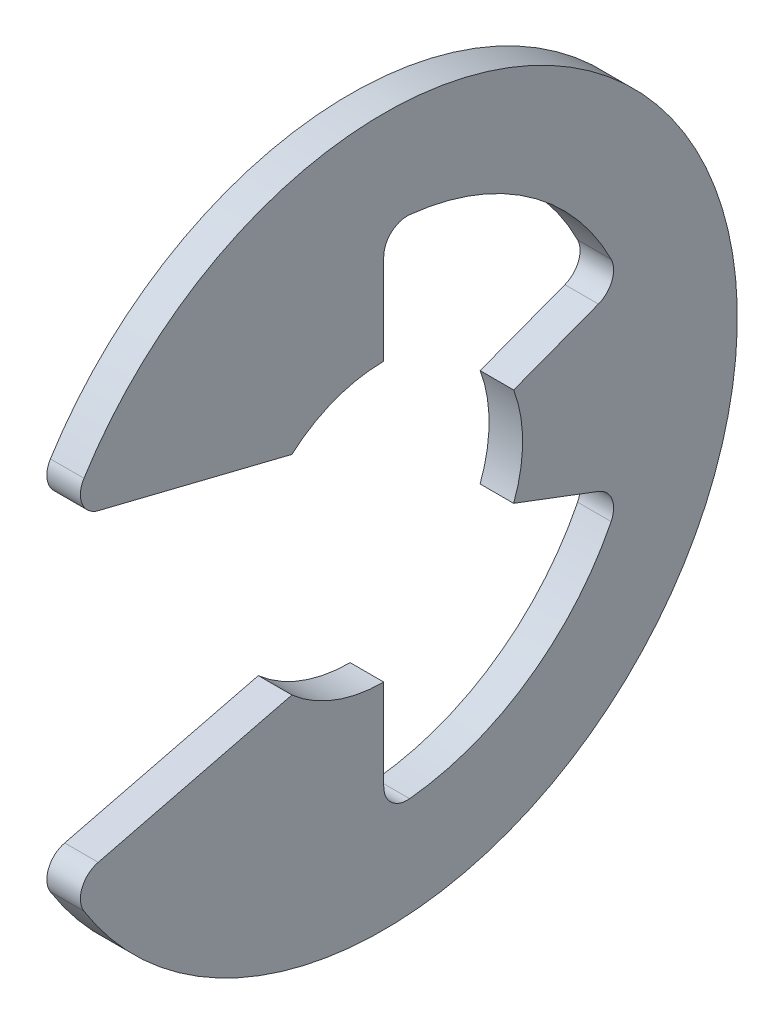
ISO-10303-21;
HEADER;
FILE_DESCRIPTION(('STEP AP214'),'2;1');
FILE_NAME('part.step','',(''),(''),'','','');
FILE_SCHEMA(('AUTOMOTIVE_DESIGN { 1 0 10303 214 1 1 1 1 }'));
ENDSEC;
DATA;
#1=APPLICATION_CONTEXT('core data for automotive mechanical design processes');
#2=APPLICATION_PROTOCOL_DEFINITION('international standard','automotive_design',2000,#1);
#3=PRODUCT_CONTEXT('',#1,'mechanical');
#4=PRODUCT('Part','Part','',(#3));
#5=PRODUCT_RELATED_PRODUCT_CATEGORY('part','',(#4));
#6=PRODUCT_DEFINITION_FORMATION('','',#4);
#7=PRODUCT_DEFINITION_CONTEXT('part definition',#1,'design');
#8=PRODUCT_DEFINITION('design','',#6,#7);
#9=PRODUCT_DEFINITION_SHAPE('','',#8);
#10=(LENGTH_UNIT() NAMED_UNIT(*) SI_UNIT(.MILLI.,.METRE.));
#11=(NAMED_UNIT(*) PLANE_ANGLE_UNIT() SI_UNIT($,.RADIAN.));
#12=(NAMED_UNIT(*) SI_UNIT($,.STERADIAN.) SOLID_ANGLE_UNIT());
#13=UNCERTAINTY_MEASURE_WITH_UNIT(LENGTH_MEASURE(1.E-05),#10,'distance_accuracy_value','');
#14=(GEOMETRIC_REPRESENTATION_CONTEXT(3) GLOBAL_UNCERTAINTY_ASSIGNED_CONTEXT((#13)) GLOBAL_UNIT_ASSIGNED_CONTEXT((#10,
#11,#12)) REPRESENTATION_CONTEXT('',''));
#15=CARTESIAN_POINT('',(0.,0.,0.));
#16=DIRECTION('',(0.,0.,1.));
#17=DIRECTION('',(1.,0.,0.));
#18=AXIS2_PLACEMENT_3D('',#15,#16,#17);
#19=CARTESIAN_POINT('',(0.3175,0.,0.));
#20=DIRECTION('',(-1.,0.,0.));
#21=DIRECTION('',(0.,0.,1.));
#22=AXIS2_PLACEMENT_3D('',#19,#20,#21);
#23=CYLINDRICAL_SURFACE('',#22,6.6929);
#24=CARTESIAN_POINT('',(0.3175,0.,0.));
#25=DIRECTION('',(1.,0.,0.));
#26=DIRECTION('',(0.,0.,-1.));
#27=AXIS2_PLACEMENT_3D('',#24,#25,#26);
#28=CIRCLE('',#27,6.6929);
#29=CARTESIAN_POINT('',(0.3175,-3.54889999540933,5.67452370094475));
#30=VERTEX_POINT('',#29);
#31=CARTESIAN_POINT('',(0.3175,3.54889999540933,5.67452370094475));
#32=VERTEX_POINT('',#31);
#33=EDGE_CURVE('E170',#30,#32,#28,.T.);
#34=ORIENTED_EDGE('',*,*,#33,.F.);
#35=DIRECTION('',(-1.,0.,0.));
#36=VECTOR('',#35,1.);
#37=CARTESIAN_POINT('',(0.3175,-3.54889999540933,5.67452370094475));
#38=LINE('',#37,#36);
#39=CARTESIAN_POINT('',(-0.3175,-3.54889999540933,5.67452370094475));
#40=VERTEX_POINT('',#39);
#41=EDGE_CURVE('E264',#30,#40,#38,.T.);
#42=ORIENTED_EDGE('',*,*,#41,.T.);
#43=CARTESIAN_POINT('',(-0.3175,0.,0.));
#44=DIRECTION('',(1.,0.,0.));
#45=DIRECTION('',(0.,0.,-1.));
#46=AXIS2_PLACEMENT_3D('',#43,#44,#45);
#47=CIRCLE('',#46,6.6929);
#48=CARTESIAN_POINT('',(-0.3175,3.54889999540933,5.67452370094475));
#49=VERTEX_POINT('',#48);
#50=EDGE_CURVE('E208',#40,#49,#47,.T.);
#51=ORIENTED_EDGE('',*,*,#50,.T.);
#52=DIRECTION('',(-1.,0.,0.));
#53=VECTOR('',#52,1.);
#54=CARTESIAN_POINT('',(0.3175,3.54889999540933,5.67452370094475));
#55=LINE('',#54,#53);
#56=EDGE_CURVE('E262',#49,#32,#55,.F.);
#57=ORIENTED_EDGE('',*,*,#56,.T.);
#58=EDGE_LOOP('',(#34,#42,#51,#57));
#59=FACE_BOUND('',#58,.T.);
#60=ADVANCED_FACE('F32',(#59),#23,.T.);
#61=CARTESIAN_POINT('',(0.3175,3.02251427254246,5.97154233697436));
#62=DIRECTION('',(0.,0.970536829925373,-0.240952820606872));
#63=DIRECTION('',(0.,0.240952820606873,0.970536829925373));
#64=AXIS2_PLACEMENT_3D('',#61,#62,#63);
#65=PLANE('',#64);
#66=DIRECTION('',(0.,-0.240952820606872,-0.970536829925373));
#67=VECTOR('',#66,1.);
#68=CARTESIAN_POINT('',(0.3175,3.02251427254246,5.97154233697436));
#69=LINE('',#68,#67);
#70=CARTESIAN_POINT('',(0.3175,2.88180092889208,5.40476132926225));
#71=VERTEX_POINT('',#70);
#72=CARTESIAN_POINT('',(0.3175,1.971675,1.73885390541443));
#73=VERTEX_POINT('',#72);
#74=EDGE_CURVE('E156',#71,#73,#69,.T.);
#75=ORIENTED_EDGE('',*,*,#74,.F.);
#76=DIRECTION('',(-1.,0.,0.));
#77=VECTOR('',#76,1.);
#78=CARTESIAN_POINT('',(0.3175,2.88180092889208,5.40476132926225));
#79=LINE('',#78,#77);
#80=CARTESIAN_POINT('',(-0.3175,2.88180092889208,5.40476132926225));
#81=VERTEX_POINT('',#80);
#82=EDGE_CURVE('E276',#71,#81,#79,.T.);
#83=ORIENTED_EDGE('',*,*,#82,.T.);
#84=DIRECTION('',(0.,-0.240952820606872,-0.970536829925373));
#85=VECTOR('',#84,1.);
#86=CARTESIAN_POINT('',(-0.3175,3.02251427254246,5.97154233697436));
#87=LINE('',#86,#85);
#88=CARTESIAN_POINT('',(-0.3175,1.971675,1.73885390541443));
#89=VERTEX_POINT('',#88);
#90=EDGE_CURVE('E176',#81,#89,#87,.T.);
#91=ORIENTED_EDGE('',*,*,#90,.T.);
#92=DIRECTION('',(-1.,0.,0.));
#93=VECTOR('',#92,1.);
#94=CARTESIAN_POINT('',(0.3175,1.971675,1.73885390541443));
#95=LINE('',#94,#93);
#96=EDGE_CURVE('E173',#73,#89,#95,.T.);
#97=ORIENTED_EDGE('',*,*,#96,.F.);
#98=EDGE_LOOP('',(#75,#83,#91,#97));
#99=FACE_BOUND('',#98,.T.);
#100=ADVANCED_FACE('F174',(#99),#65,.F.);
#101=CARTESIAN_POINT('',(0.3175,0.,0.));
#102=DIRECTION('',(-1.,0.,0.));
#103=DIRECTION('',(0.,0.,1.));
#104=AXIS2_PLACEMENT_3D('',#101,#102,#103);
#105=CYLINDRICAL_SURFACE('',#104,2.6289);
#106=CARTESIAN_POINT('',(-0.3175,0.,0.));
#107=DIRECTION('',(-1.,0.,0.));
#108=DIRECTION('',(0.,0.,1.));
#109=AXIS2_PLACEMENT_3D('',#106,#107,#108);
#110=CIRCLE('',#109,2.6289);
#111=CARTESIAN_POINT('',(-0.3175,2.6289,0.));
#112=VERTEX_POINT('',#111);
#113=EDGE_CURVE('E212',#89,#112,#110,.T.);
#114=ORIENTED_EDGE('',*,*,#113,.T.);
#115=DIRECTION('',(-1.,0.,0.));
#116=VECTOR('',#115,1.);
#117=CARTESIAN_POINT('',(0.3175,2.6289,0.));
#118=LINE('',#117,#116);
#119=CARTESIAN_POINT('',(0.3175,2.6289,0.));
#120=VERTEX_POINT('',#119);
#121=EDGE_CURVE('E180',#120,#112,#118,.T.);
#122=ORIENTED_EDGE('',*,*,#121,.F.);
#123=CARTESIAN_POINT('',(0.3175,0.,0.));
#124=DIRECTION('',(-1.,0.,0.));
#125=DIRECTION('',(0.,0.,1.));
#126=AXIS2_PLACEMENT_3D('',#123,#124,#125);
#127=CIRCLE('',#126,2.6289);
#128=EDGE_CURVE('E162',#73,#120,#127,.T.);
#129=ORIENTED_EDGE('',*,*,#128,.F.);
#130=ORIENTED_EDGE('',*,*,#96,.T.);
#131=EDGE_LOOP('',(#114,#122,#129,#130));
#132=FACE_BOUND('',#131,.T.);
#133=ADVANCED_FACE('F182',(#132),#105,.F.);
#134=CARTESIAN_POINT('',(0.3175,2.6289,0.));
#135=DIRECTION('',(0.,0.,1.));
#136=DIRECTION('',(0.,-1.,0.));
#137=AXIS2_PLACEMENT_3D('',#134,#135,#136);
#138=PLANE('',#137);
#139=DIRECTION('',(0.,1.,0.));
#140=VECTOR('',#139,1.);
#141=CARTESIAN_POINT('',(-0.3175,2.6289,0.));
#142=LINE('',#141,#140);
#143=CARTESIAN_POINT('',(-0.3175,4.34406945142374,0.));
#144=VERTEX_POINT('',#143);
#145=EDGE_CURVE('E214',#112,#144,#142,.T.);
#146=ORIENTED_EDGE('',*,*,#145,.T.);
#147=DIRECTION('',(1.,0.,0.));
#148=VECTOR('',#147,1.);
#149=CARTESIAN_POINT('',(0.3175,4.34406945142374,0.));
#150=LINE('',#149,#148);
#151=CARTESIAN_POINT('',(0.3175,4.34406945142374,0.));
#152=VERTEX_POINT('',#151);
#153=EDGE_CURVE('E260',#144,#152,#150,.T.);
#154=ORIENTED_EDGE('',*,*,#153,.T.);
#155=DIRECTION('',(0.,1.,0.));
#156=VECTOR('',#155,1.);
#157=CARTESIAN_POINT('',(0.3175,2.6289,0.));
#158=LINE('',#157,#156);
#159=EDGE_CURVE('E185',#120,#152,#158,.T.);
#160=ORIENTED_EDGE('',*,*,#159,.F.);
#161=ORIENTED_EDGE('',*,*,#121,.T.);
#162=EDGE_LOOP('',(#146,#154,#160,#161));
#163=FACE_BOUND('',#162,.T.);
#164=ADVANCED_FACE('F382',(#163),#138,.F.);
#165=CARTESIAN_POINT('',(0.3175,0.,0.));
#166=DIRECTION('',(-1.,0.,0.));
#167=DIRECTION('',(0.,0.,1.));
#168=AXIS2_PLACEMENT_3D('',#165,#166,#167);
#169=CYLINDRICAL_SURFACE('',#168,4.81125161290323);
#170=CARTESIAN_POINT('',(0.3175,0.,0.));
#171=DIRECTION('',(-1.,0.,0.));
#172=DIRECTION('',(0.,0.,-1.));
#173=AXIS2_PLACEMENT_3D('',#170,#171,#172);
#174=CIRCLE('',#173,4.81125161290323);
#175=CARTESIAN_POINT('',(0.3175,4.78626059081718,-0.489746505300684));
#176=VERTEX_POINT('',#175);
#177=CARTESIAN_POINT('',(0.3175,2.15031456744764,-4.30398528618377));
#178=VERTEX_POINT('',#177);
#179=EDGE_CURVE('E187',#176,#178,#174,.T.);
#180=ORIENTED_EDGE('',*,*,#179,.F.);
#181=DIRECTION('',(-1.,0.,0.));
#182=VECTOR('',#181,1.);
#183=CARTESIAN_POINT('',(0.3175,4.78626059081718,-0.489746505300684));
#184=LINE('',#183,#182);
#185=CARTESIAN_POINT('',(-0.3175,4.78626059081718,-0.489746505300684));
#186=VERTEX_POINT('',#185);
#187=EDGE_CURVE('E257',#176,#186,#184,.T.);
#188=ORIENTED_EDGE('',*,*,#187,.T.);
#189=CARTESIAN_POINT('',(-0.3175,0.,0.));
#190=DIRECTION('',(-1.,0.,0.));
#191=DIRECTION('',(0.,0.,-1.));
#192=AXIS2_PLACEMENT_3D('',#189,#190,#191);
#193=CIRCLE('',#192,4.81125161290323);
#194=CARTESIAN_POINT('',(-0.3175,2.15031456744764,-4.30398528618377));
#195=VERTEX_POINT('',#194);
#196=EDGE_CURVE('E217',#186,#195,#193,.T.);
#197=ORIENTED_EDGE('',*,*,#196,.T.);
#198=DIRECTION('',(-1.,0.,0.));
#199=VECTOR('',#198,1.);
#200=CARTESIAN_POINT('',(0.3175,2.15031456744764,-4.30398528618377));
#201=LINE('',#200,#199);
#202=EDGE_CURVE('E255',#195,#178,#201,.F.);
#203=ORIENTED_EDGE('',*,*,#202,.T.);
#204=EDGE_LOOP('',(#180,#188,#197,#203));
#205=FACE_BOUND('',#204,.T.);
#206=ADVANCED_FACE('F304',(#205),#169,.F.);
#207=CARTESIAN_POINT('',(0.3175,0.929456508530658,-2.4591107760225));
#208=DIRECTION('',(0.,-0.935414346693485,-0.353553390593274));
#209=DIRECTION('',(0.,0.353553390593274,-0.935414346693485));
#210=AXIS2_PLACEMENT_3D('',#207,#208,#209);
#211=PLANE('',#210);
#212=DIRECTION('',(0.,-0.353553390593274,0.935414346693485));
#213=VECTOR('',#212,1.);
#214=CARTESIAN_POINT('',(0.3175,0.929456508530658,-2.4591107760225));
#215=LINE('',#214,#213);
#216=CARTESIAN_POINT('',(0.3175,1.53586048352353,-4.06350488789466));
#217=VERTEX_POINT('',#216);
#218=CARTESIAN_POINT('',(0.3175,0.929456508530658,-2.4591107760225));
#219=VERTEX_POINT('',#218);
#220=EDGE_CURVE('E192',#217,#219,#215,.T.);
#221=ORIENTED_EDGE('',*,*,#220,.F.);
#222=DIRECTION('',(1.,0.,0.));
#223=VECTOR('',#222,1.);
#224=CARTESIAN_POINT('',(-0.3175,1.53586048352353,-4.06350488789466));
#225=LINE('',#224,#223);
#226=CARTESIAN_POINT('',(-0.3175,1.53586048352353,-4.06350488789466));
#227=VERTEX_POINT('',#226);
#228=EDGE_CURVE('E279',#217,#227,#225,.F.);
#229=ORIENTED_EDGE('',*,*,#228,.T.);
#230=DIRECTION('',(0.,-0.353553390593274,0.935414346693485));
#231=VECTOR('',#230,1.);
#232=CARTESIAN_POINT('',(-0.3175,0.929456508530658,-2.4591107760225));
#233=LINE('',#232,#231);
#234=CARTESIAN_POINT('',(-0.3175,0.929456508530658,-2.4591107760225));
#235=VERTEX_POINT('',#234);
#236=EDGE_CURVE('E220',#227,#235,#233,.T.);
#237=ORIENTED_EDGE('',*,*,#236,.T.);
#238=DIRECTION('',(-1.,0.,0.));
#239=VECTOR('',#238,1.);
#240=CARTESIAN_POINT('',(0.3175,0.929456508530658,-2.4591107760225));
#241=LINE('',#240,#239);
#242=EDGE_CURVE('E244',#219,#235,#241,.T.);
#243=ORIENTED_EDGE('',*,*,#242,.F.);
#244=EDGE_LOOP('',(#221,#229,#237,#243));
#245=FACE_BOUND('',#244,.T.);
#246=ADVANCED_FACE('F307',(#245),#211,.F.);
#247=CARTESIAN_POINT('',(0.3175,0.,0.));
#248=DIRECTION('',(-1.,0.,0.));
#249=DIRECTION('',(0.,0.,1.));
#250=AXIS2_PLACEMENT_3D('',#247,#248,#249);
#251=CYLINDRICAL_SURFACE('',#250,2.6289);
#252=CARTESIAN_POINT('',(-0.3175,0.,0.));
#253=DIRECTION('',(-1.,0.,0.));
#254=DIRECTION('',(0.,0.,1.));
#255=AXIS2_PLACEMENT_3D('',#252,#253,#254);
#256=CIRCLE('',#255,2.6289);
#257=CARTESIAN_POINT('',(-0.3175,-0.929456508530657,-2.4591107760225));
#258=VERTEX_POINT('',#257);
#259=EDGE_CURVE('E222',#235,#258,#256,.T.);
#260=ORIENTED_EDGE('',*,*,#259,.T.);
#261=DIRECTION('',(-1.,0.,0.));
#262=VECTOR('',#261,1.);
#263=CARTESIAN_POINT('',(0.3175,-0.929456508530657,-2.4591107760225));
#264=LINE('',#263,#262);
#265=CARTESIAN_POINT('',(0.3175,-0.929456508530657,-2.4591107760225));
#266=VERTEX_POINT('',#265);
#267=EDGE_CURVE('E241',#266,#258,#264,.T.);
#268=ORIENTED_EDGE('',*,*,#267,.F.);
#269=CARTESIAN_POINT('',(0.3175,0.,0.));
#270=DIRECTION('',(-1.,0.,0.));
#271=DIRECTION('',(0.,0.,1.));
#272=AXIS2_PLACEMENT_3D('',#269,#270,#271);
#273=CIRCLE('',#272,2.6289);
#274=EDGE_CURVE('E194',#219,#266,#273,.T.);
#275=ORIENTED_EDGE('',*,*,#274,.F.);
#276=ORIENTED_EDGE('',*,*,#242,.T.);
#277=EDGE_LOOP('',(#260,#268,#275,#276));
#278=FACE_BOUND('',#277,.T.);
#279=ADVANCED_FACE('F313',(#278),#251,.F.);
#280=CARTESIAN_POINT('',(0.3175,-0.929456508530657,-2.4591107760225));
#281=DIRECTION('',(0.,0.935414346693485,-0.353553390593274));
#282=DIRECTION('',(0.,0.353553390593274,0.935414346693485));
#283=AXIS2_PLACEMENT_3D('',#280,#281,#282);
#284=PLANE('',#283);
#285=DIRECTION('',(0.,-0.353553390593274,-0.935414346693485));
#286=VECTOR('',#285,1.);
#287=CARTESIAN_POINT('',(-0.3175,-0.929456508530657,-2.4591107760225));
#288=LINE('',#287,#286);
#289=CARTESIAN_POINT('',(-0.3175,-1.53586048352352,-4.06350488789466));
#290=VERTEX_POINT('',#289);
#291=EDGE_CURVE('E224',#258,#290,#288,.T.);
#292=ORIENTED_EDGE('',*,*,#291,.T.);
#293=DIRECTION('',(1.,0.,0.));
#294=VECTOR('',#293,1.);
#295=CARTESIAN_POINT('',(0.3175,-1.53586048352352,-4.06350488789466));
#296=LINE('',#295,#294);
#297=CARTESIAN_POINT('',(0.3175,-1.53586048352352,-4.06350488789466));
#298=VERTEX_POINT('',#297);
#299=EDGE_CURVE('E47',#290,#298,#296,.T.);
#300=ORIENTED_EDGE('',*,*,#299,.T.);
#301=DIRECTION('',(0.,-0.353553390593274,-0.935414346693485));
#302=VECTOR('',#301,1.);
#303=CARTESIAN_POINT('',(0.3175,-0.929456508530657,-2.4591107760225));
#304=LINE('',#303,#302);
#305=EDGE_CURVE('E196',#266,#298,#304,.T.);
#306=ORIENTED_EDGE('',*,*,#305,.F.);
#307=ORIENTED_EDGE('',*,*,#267,.T.);
#308=EDGE_LOOP('',(#292,#300,#306,#307));
#309=FACE_BOUND('',#308,.T.);
#310=ADVANCED_FACE('F315',(#309),#284,.F.);
#311=CARTESIAN_POINT('',(0.3175,0.,0.));
#312=DIRECTION('',(-1.,0.,0.));
#313=DIRECTION('',(0.,0.,1.));
#314=AXIS2_PLACEMENT_3D('',#311,#312,#313);
#315=CYLINDRICAL_SURFACE('',#314,4.81125161290323);
#316=CARTESIAN_POINT('',(-0.3175,0.,0.));
#317=DIRECTION('',(-1.,0.,0.));
#318=DIRECTION('',(0.,0.,-1.));
#319=AXIS2_PLACEMENT_3D('',#316,#317,#318);
#320=CIRCLE('',#319,4.81125161290323);
#321=CARTESIAN_POINT('',(-0.3175,-2.15031456744764,-4.30398528618377));
#322=VERTEX_POINT('',#321);
#323=CARTESIAN_POINT('',(-0.3175,-4.78626059081718,-0.489746505300685));
#324=VERTEX_POINT('',#323);
#325=EDGE_CURVE('E226',#322,#324,#320,.T.);
#326=ORIENTED_EDGE('',*,*,#325,.T.);
#327=DIRECTION('',(-1.,0.,0.));
#328=VECTOR('',#327,1.);
#329=CARTESIAN_POINT('',(0.3175,-4.78626059081718,-0.489746505300685));
#330=LINE('',#329,#328);
#331=CARTESIAN_POINT('',(0.3175,-4.78626059081718,-0.489746505300685));
#332=VERTEX_POINT('',#331);
#333=EDGE_CURVE('E253',#324,#332,#330,.F.);
#334=ORIENTED_EDGE('',*,*,#333,.T.);
#335=CARTESIAN_POINT('',(0.3175,0.,0.));
#336=DIRECTION('',(-1.,0.,0.));
#337=DIRECTION('',(0.,0.,-1.));
#338=AXIS2_PLACEMENT_3D('',#335,#336,#337);
#339=CIRCLE('',#338,4.81125161290323);
#340=CARTESIAN_POINT('',(0.3175,-2.15031456744764,-4.30398528618377));
#341=VERTEX_POINT('',#340);
#342=EDGE_CURVE('E198',#341,#332,#339,.T.);
#343=ORIENTED_EDGE('',*,*,#342,.F.);
#344=DIRECTION('',(-1.,0.,0.));
#345=VECTOR('',#344,1.);
#346=CARTESIAN_POINT('',(0.3175,-2.15031456744764,-4.30398528618377));
#347=LINE('',#346,#345);
#348=EDGE_CURVE('E250',#341,#322,#347,.T.);
#349=ORIENTED_EDGE('',*,*,#348,.T.);
#350=EDGE_LOOP('',(#326,#334,#343,#349));
#351=FACE_BOUND('',#350,.T.);
#352=ADVANCED_FACE('F317',(#351),#315,.F.);
#353=CARTESIAN_POINT('',(0.3175,-2.6289,0.));
#354=DIRECTION('',(0.,0.,1.));
#355=DIRECTION('',(0.,-1.,0.));
#356=AXIS2_PLACEMENT_3D('',#353,#354,#355);
#357=PLANE('',#356);
#358=DIRECTION('',(0.,1.,0.));
#359=VECTOR('',#358,1.);
#360=CARTESIAN_POINT('',(0.3175,-2.6289,0.));
#361=LINE('',#360,#359);
#362=CARTESIAN_POINT('',(0.3175,-4.34406945142374,0.));
#363=VERTEX_POINT('',#362);
#364=CARTESIAN_POINT('',(0.3175,-2.6289,0.));
#365=VERTEX_POINT('',#364);
#366=EDGE_CURVE('E201',#363,#365,#361,.T.);
#367=ORIENTED_EDGE('',*,*,#366,.F.);
#368=DIRECTION('',(1.,0.,0.));
#369=VECTOR('',#368,1.);
#370=CARTESIAN_POINT('',(-0.3175,-4.34406945142374,0.));
#371=LINE('',#370,#369);
#372=CARTESIAN_POINT('',(-0.3175,-4.34406945142374,0.));
#373=VERTEX_POINT('',#372);
#374=EDGE_CURVE('E179',#363,#373,#371,.F.);
#375=ORIENTED_EDGE('',*,*,#374,.T.);
#376=DIRECTION('',(0.,1.,0.));
#377=VECTOR('',#376,1.);
#378=CARTESIAN_POINT('',(-0.3175,-2.6289,0.));
#379=LINE('',#378,#377);
#380=CARTESIAN_POINT('',(-0.3175,-2.6289,0.));
#381=VERTEX_POINT('',#380);
#382=EDGE_CURVE('E229',#373,#381,#379,.T.);
#383=ORIENTED_EDGE('',*,*,#382,.T.);
#384=DIRECTION('',(-1.,0.,0.));
#385=VECTOR('',#384,1.);
#386=CARTESIAN_POINT('',(0.3175,-2.6289,0.));
#387=LINE('',#386,#385);
#388=EDGE_CURVE('E238',#365,#381,#387,.T.);
#389=ORIENTED_EDGE('',*,*,#388,.F.);
#390=EDGE_LOOP('',(#367,#375,#383,#389));
#391=FACE_BOUND('',#390,.T.);
#392=ADVANCED_FACE('F323',(#391),#357,.F.);
#393=CARTESIAN_POINT('',(0.3175,0.,0.));
#394=DIRECTION('',(-1.,0.,0.));
#395=DIRECTION('',(0.,0.,1.));
#396=AXIS2_PLACEMENT_3D('',#393,#394,#395);
#397=CYLINDRICAL_SURFACE('',#396,2.6289);
#398=CARTESIAN_POINT('',(-0.3175,0.,0.));
#399=DIRECTION('',(-1.,0.,0.));
#400=DIRECTION('',(0.,0.,-1.));
#401=AXIS2_PLACEMENT_3D('',#398,#399,#400);
#402=CIRCLE('',#401,2.6289);
#403=CARTESIAN_POINT('',(-0.3175,-1.971675,1.73885390541443));
#404=VERTEX_POINT('',#403);
#405=EDGE_CURVE('E231',#381,#404,#402,.T.);
#406=ORIENTED_EDGE('',*,*,#405,.T.);
#407=DIRECTION('',(-1.,0.,0.));
#408=VECTOR('',#407,1.);
#409=CARTESIAN_POINT('',(0.3175,-1.971675,1.73885390541443));
#410=LINE('',#409,#408);
#411=CARTESIAN_POINT('',(0.3175,-1.971675,1.73885390541443));
#412=VERTEX_POINT('',#411);
#413=EDGE_CURVE('E207',#412,#404,#410,.T.);
#414=ORIENTED_EDGE('',*,*,#413,.F.);
#415=CARTESIAN_POINT('',(0.3175,0.,0.));
#416=DIRECTION('',(-1.,0.,0.));
#417=DIRECTION('',(0.,0.,-1.));
#418=AXIS2_PLACEMENT_3D('',#415,#416,#417);
#419=CIRCLE('',#418,2.6289);
#420=EDGE_CURVE('E203',#365,#412,#419,.T.);
#421=ORIENTED_EDGE('',*,*,#420,.F.);
#422=ORIENTED_EDGE('',*,*,#388,.T.);
#423=EDGE_LOOP('',(#406,#414,#421,#422));
#424=FACE_BOUND('',#423,.T.);
#425=ADVANCED_FACE('F372',(#424),#397,.F.);
#426=CARTESIAN_POINT('',(0.3175,-3.02251427254246,5.97154233697435));
#427=DIRECTION('',(0.,-0.970536829925373,-0.240952820606873));
#428=DIRECTION('',(0.,0.240952820606873,-0.970536829925373));
#429=AXIS2_PLACEMENT_3D('',#426,#427,#428);
#430=PLANE('',#429);
#431=DIRECTION('',(0.,-0.240952820606873,0.970536829925373));
#432=VECTOR('',#431,1.);
#433=CARTESIAN_POINT('',(-0.3175,-3.02251427254246,5.97154233697435));
#434=LINE('',#433,#432);
#435=CARTESIAN_POINT('',(-0.3175,-2.88180092889208,5.40476132926225));
#436=VERTEX_POINT('',#435);
#437=EDGE_CURVE('E233',#404,#436,#434,.T.);
#438=ORIENTED_EDGE('',*,*,#437,.T.);
#439=DIRECTION('',(-1.,0.,0.));
#440=VECTOR('',#439,1.);
#441=CARTESIAN_POINT('',(0.3175,-2.88180092889208,5.40476132926225));
#442=LINE('',#441,#440);
#443=CARTESIAN_POINT('',(0.3175,-2.88180092889208,5.40476132926225));
#444=VERTEX_POINT('',#443);
#445=EDGE_CURVE('E271',#436,#444,#442,.F.);
#446=ORIENTED_EDGE('',*,*,#445,.T.);
#447=DIRECTION('',(0.,-0.240952820606873,0.970536829925373));
#448=VECTOR('',#447,1.);
#449=CARTESIAN_POINT('',(0.3175,-3.02251427254246,5.97154233697435));
#450=LINE('',#449,#448);
#451=EDGE_CURVE('E205',#412,#444,#450,.T.);
#452=ORIENTED_EDGE('',*,*,#451,.F.);
#453=ORIENTED_EDGE('',*,*,#413,.T.);
#454=EDGE_LOOP('',(#438,#446,#452,#453));
#455=FACE_BOUND('',#454,.T.);
#456=ADVANCED_FACE('F414',(#455),#430,.F.);
#457=CARTESIAN_POINT('',(0.3175,0.,0.));
#458=DIRECTION('',(1.,0.,0.));
#459=DIRECTION('',(0.,0.,-1.));
#460=AXIS2_PLACEMENT_3D('',#457,#458,#459);
#461=PLANE('',#460);
#462=ORIENTED_EDGE('',*,*,#451,.T.);
#463=CARTESIAN_POINT('',(0.3175,-3.31320454979391,5.2976578005025));
#464=DIRECTION('',(1.,0.,0.));
#465=DIRECTION('',(0.,0.,-1.));
#466=AXIS2_PLACEMENT_3D('',#463,#464,#465);
#467=CIRCLE('',#466,0.4445);
#468=EDGE_CURVE('E274',#444,#30,#467,.T.);
#469=ORIENTED_EDGE('',*,*,#468,.T.);
#470=ORIENTED_EDGE('',*,*,#33,.T.);
#471=CARTESIAN_POINT('',(0.3175,3.31320454979391,5.2976578005025));
#472=DIRECTION('',(1.,0.,0.));
#473=DIRECTION('',(0.,0.,-1.));
#474=AXIS2_PLACEMENT_3D('',#471,#472,#473);
#475=CIRCLE('',#474,0.4445);
#476=EDGE_CURVE('E166',#32,#71,#475,.T.);
#477=ORIENTED_EDGE('',*,*,#476,.T.);
#478=ORIENTED_EDGE('',*,*,#74,.T.);
#479=ORIENTED_EDGE('',*,*,#128,.T.);
#480=ORIENTED_EDGE('',*,*,#159,.T.);
#481=CARTESIAN_POINT('',(0.3175,4.34406945142374,-0.444499999999999));
#482=DIRECTION('',(1.,0.,0.));
#483=DIRECTION('',(0.,0.,-1.));
#484=AXIS2_PLACEMENT_3D('',#481,#482,#483);
#485=CIRCLE('',#484,0.4445);
#486=EDGE_CURVE('E288',#152,#176,#485,.F.);
#487=ORIENTED_EDGE('',*,*,#486,.T.);
#488=ORIENTED_EDGE('',*,*,#179,.T.);
#489=CARTESIAN_POINT('',(0.3175,1.95165216062878,-3.90635040577595));
#490=DIRECTION('',(1.,0.,0.));
#491=DIRECTION('',(0.,0.,-1.));
#492=AXIS2_PLACEMENT_3D('',#489,#490,#491);
#493=CIRCLE('',#492,0.4445);
#494=EDGE_CURVE('E11',#178,#217,#493,.F.);
#495=ORIENTED_EDGE('',*,*,#494,.T.);
#496=ORIENTED_EDGE('',*,*,#220,.T.);
#497=ORIENTED_EDGE('',*,*,#274,.T.);
#498=ORIENTED_EDGE('',*,*,#305,.T.);
#499=CARTESIAN_POINT('',(0.3175,-1.95165216062878,-3.90635040577595));
#500=DIRECTION('',(1.,0.,0.));
#501=DIRECTION('',(0.,0.,-1.));
#502=AXIS2_PLACEMENT_3D('',#499,#500,#501);
#503=CIRCLE('',#502,0.4445);
#504=EDGE_CURVE('E292',#298,#341,#503,.F.);
#505=ORIENTED_EDGE('',*,*,#504,.T.);
#506=ORIENTED_EDGE('',*,*,#342,.T.);
#507=CARTESIAN_POINT('',(0.3175,-4.34406945142374,-0.4445));
#508=DIRECTION('',(1.,0.,0.));
#509=DIRECTION('',(0.,0.,-1.));
#510=AXIS2_PLACEMENT_3D('',#507,#508,#509);
#511=CIRCLE('',#510,0.4445);
#512=EDGE_CURVE('E284',#332,#363,#511,.F.);
#513=ORIENTED_EDGE('',*,*,#512,.T.);
#514=ORIENTED_EDGE('',*,*,#366,.T.);
#515=ORIENTED_EDGE('',*,*,#420,.T.);
#516=EDGE_LOOP('',(#462,#469,#470,#477,#478,#479,#480,#487,#488,#495,#496,#497,#498,#505,#506,
#513,#514,#515));
#517=FACE_BOUND('',#516,.T.);
#518=ADVANCED_FACE('F159',(#517),#461,.T.);
#519=CARTESIAN_POINT('',(-0.3175,0.,0.));
#520=DIRECTION('',(1.,0.,0.));
#521=DIRECTION('',(0.,0.,-1.));
#522=AXIS2_PLACEMENT_3D('',#519,#520,#521);
#523=PLANE('',#522);
#524=ORIENTED_EDGE('',*,*,#50,.F.);
#525=CARTESIAN_POINT('',(-0.3175,-3.31320454979391,5.2976578005025));
#526=DIRECTION('',(1.,0.,0.));
#527=DIRECTION('',(0.,0.,-1.));
#528=AXIS2_PLACEMENT_3D('',#525,#526,#527);
#529=CIRCLE('',#528,0.4445);
#530=EDGE_CURVE('E269',#40,#436,#529,.F.);
#531=ORIENTED_EDGE('',*,*,#530,.T.);
#532=ORIENTED_EDGE('',*,*,#437,.F.);
#533=ORIENTED_EDGE('',*,*,#405,.F.);
#534=ORIENTED_EDGE('',*,*,#382,.F.);
#535=CARTESIAN_POINT('',(-0.3175,-4.34406945142374,-0.4445));
#536=DIRECTION('',(1.,0.,0.));
#537=DIRECTION('',(0.,0.,-1.));
#538=AXIS2_PLACEMENT_3D('',#535,#536,#537);
#539=CIRCLE('',#538,0.4445);
#540=EDGE_CURVE('E282',#373,#324,#539,.T.);
#541=ORIENTED_EDGE('',*,*,#540,.T.);
#542=ORIENTED_EDGE('',*,*,#325,.F.);
#543=CARTESIAN_POINT('',(-0.3175,-1.95165216062878,-3.90635040577595));
#544=DIRECTION('',(1.,0.,0.));
#545=DIRECTION('',(0.,0.,-1.));
#546=AXIS2_PLACEMENT_3D('',#543,#544,#545);
#547=CIRCLE('',#546,0.4445);
#548=EDGE_CURVE('E290',#322,#290,#547,.T.);
#549=ORIENTED_EDGE('',*,*,#548,.T.);
#550=ORIENTED_EDGE('',*,*,#291,.F.);
#551=ORIENTED_EDGE('',*,*,#259,.F.);
#552=ORIENTED_EDGE('',*,*,#236,.F.);
#553=CARTESIAN_POINT('',(-0.3175,1.95165216062878,-3.90635040577595));
#554=DIRECTION('',(1.,0.,0.));
#555=DIRECTION('',(0.,0.,-1.));
#556=AXIS2_PLACEMENT_3D('',#553,#554,#555);
#557=CIRCLE('',#556,0.4445);
#558=EDGE_CURVE('E40',#227,#195,#557,.T.);
#559=ORIENTED_EDGE('',*,*,#558,.T.);
#560=ORIENTED_EDGE('',*,*,#196,.F.);
#561=CARTESIAN_POINT('',(-0.3175,4.34406945142374,-0.444499999999999));
#562=DIRECTION('',(1.,0.,0.));
#563=DIRECTION('',(0.,0.,-1.));
#564=AXIS2_PLACEMENT_3D('',#561,#562,#563);
#565=CIRCLE('',#564,0.4445);
#566=EDGE_CURVE('E286',#186,#144,#565,.T.);
#567=ORIENTED_EDGE('',*,*,#566,.T.);
#568=ORIENTED_EDGE('',*,*,#145,.F.);
#569=ORIENTED_EDGE('',*,*,#113,.F.);
#570=ORIENTED_EDGE('',*,*,#90,.F.);
#571=CARTESIAN_POINT('',(-0.3175,3.31320454979391,5.2976578005025));
#572=DIRECTION('',(1.,0.,0.));
#573=DIRECTION('',(0.,0.,-1.));
#574=AXIS2_PLACEMENT_3D('',#571,#572,#573);
#575=CIRCLE('',#574,0.4445);
#576=EDGE_CURVE('E267',#81,#49,#575,.F.);
#577=ORIENTED_EDGE('',*,*,#576,.T.);
#578=EDGE_LOOP('',(#524,#531,#532,#533,#534,#541,#542,#549,#550,#551,#552,#559,#560,#567,#568,
#569,#570,#577));
#579=FACE_BOUND('',#578,.T.);
#580=ADVANCED_FACE('F297',(#579),#523,.F.);
#581=CARTESIAN_POINT('',(0.3175,-4.34406945142374,-0.4445));
#582=DIRECTION('',(-1.,0.,0.));
#583=DIRECTION('',(0.,0.,1.));
#584=AXIS2_PLACEMENT_3D('',#581,#582,#583);
#585=CYLINDRICAL_SURFACE('',#584,0.4445);
#586=ORIENTED_EDGE('',*,*,#512,.F.);
#587=ORIENTED_EDGE('',*,*,#333,.F.);
#588=ORIENTED_EDGE('',*,*,#540,.F.);
#589=ORIENTED_EDGE('',*,*,#374,.F.);
#590=EDGE_LOOP('',(#586,#587,#588,#589));
#591=FACE_BOUND('',#590,.T.);
#592=ADVANCED_FACE('F337',(#591),#585,.F.);
#593=CARTESIAN_POINT('',(0.3175,4.34406945142374,-0.444499999999999));
#594=DIRECTION('',(-1.,0.,0.));
#595=DIRECTION('',(0.,0.,1.));
#596=AXIS2_PLACEMENT_3D('',#593,#594,#595);
#597=CYLINDRICAL_SURFACE('',#596,0.4445);
#598=ORIENTED_EDGE('',*,*,#486,.F.);
#599=ORIENTED_EDGE('',*,*,#153,.F.);
#600=ORIENTED_EDGE('',*,*,#566,.F.);
#601=ORIENTED_EDGE('',*,*,#187,.F.);
#602=EDGE_LOOP('',(#598,#599,#600,#601));
#603=FACE_BOUND('',#602,.T.);
#604=ADVANCED_FACE('F340',(#603),#597,.F.);
#605=CARTESIAN_POINT('',(0.3175,-3.31320454979391,5.2976578005025));
#606=DIRECTION('',(-1.,0.,0.));
#607=DIRECTION('',(0.,0.,1.));
#608=AXIS2_PLACEMENT_3D('',#605,#606,#607);
#609=CYLINDRICAL_SURFACE('',#608,0.4445);
#610=ORIENTED_EDGE('',*,*,#468,.F.);
#611=ORIENTED_EDGE('',*,*,#445,.F.);
#612=ORIENTED_EDGE('',*,*,#530,.F.);
#613=ORIENTED_EDGE('',*,*,#41,.F.);
#614=EDGE_LOOP('',(#610,#611,#612,#613));
#615=FACE_BOUND('',#614,.T.);
#616=ADVANCED_FACE('F344',(#615),#609,.T.);
#617=CARTESIAN_POINT('',(0.3175,3.31320454979391,5.2976578005025));
#618=DIRECTION('',(-1.,0.,0.));
#619=DIRECTION('',(0.,0.,1.));
#620=AXIS2_PLACEMENT_3D('',#617,#618,#619);
#621=CYLINDRICAL_SURFACE('',#620,0.4445);
#622=ORIENTED_EDGE('',*,*,#476,.F.);
#623=ORIENTED_EDGE('',*,*,#56,.F.);
#624=ORIENTED_EDGE('',*,*,#576,.F.);
#625=ORIENTED_EDGE('',*,*,#82,.F.);
#626=EDGE_LOOP('',(#622,#623,#624,#625));
#627=FACE_BOUND('',#626,.T.);
#628=ADVANCED_FACE('F348',(#627),#621,.T.);
#629=CARTESIAN_POINT('',(0.3175,-1.95165216062878,-3.90635040577595));
#630=DIRECTION('',(-1.,0.,0.));
#631=DIRECTION('',(0.,0.,1.));
#632=AXIS2_PLACEMENT_3D('',#629,#630,#631);
#633=CYLINDRICAL_SURFACE('',#632,0.4445);
#634=ORIENTED_EDGE('',*,*,#504,.F.);
#635=ORIENTED_EDGE('',*,*,#299,.F.);
#636=ORIENTED_EDGE('',*,*,#548,.F.);
#637=ORIENTED_EDGE('',*,*,#348,.F.);
#638=EDGE_LOOP('',(#634,#635,#636,#637));
#639=FACE_BOUND('',#638,.T.);
#640=ADVANCED_FACE('F351',(#639),#633,.F.);
#641=CARTESIAN_POINT('',(0.3175,1.95165216062878,-3.90635040577595));
#642=DIRECTION('',(-1.,0.,0.));
#643=DIRECTION('',(0.,0.,1.));
#644=AXIS2_PLACEMENT_3D('',#641,#642,#643);
#645=CYLINDRICAL_SURFACE('',#644,0.4445);
#646=ORIENTED_EDGE('',*,*,#494,.F.);
#647=ORIENTED_EDGE('',*,*,#202,.F.);
#648=ORIENTED_EDGE('',*,*,#558,.F.);
#649=ORIENTED_EDGE('',*,*,#228,.F.);
#650=EDGE_LOOP('',(#646,#647,#648,#649));
#651=FACE_BOUND('',#650,.T.);
#652=ADVANCED_FACE('F34',(#651),#645,.F.);
#653=CLOSED_SHELL('',(#60,#100,#133,#164,#206,#246,#279,#310,#352,#392,#425,#456,#518,#580,#592,
#604,#616,#628,#640,#652));
#654=MANIFOLD_SOLID_BREP('B2',#653);
#655=ADVANCED_BREP_SHAPE_REPRESENTATION('',(#18,#654),#14);
#656=SHAPE_DEFINITION_REPRESENTATION(#9,#655);
ENDSEC;
END-ISO-10303-21;
